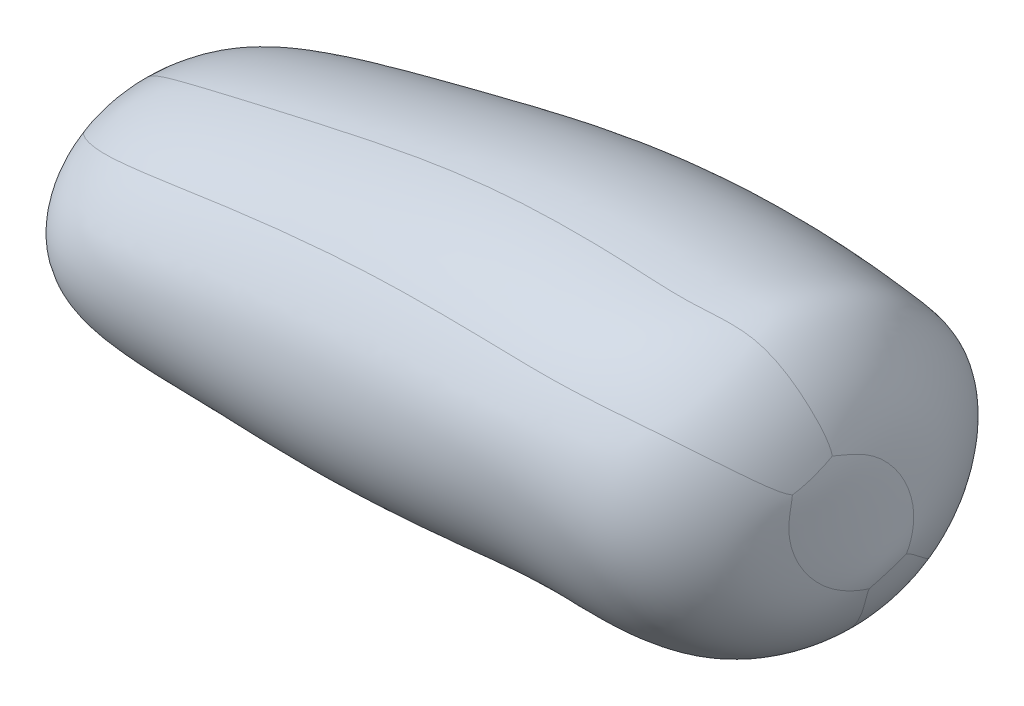
ISO-10303-21;
HEADER;
FILE_DESCRIPTION(('STEP AP214'),'2;1');
FILE_NAME('part.step','',(''),(''),'','','');
FILE_SCHEMA(('AUTOMOTIVE_DESIGN { 1 0 10303 214 1 1 1 1 }'));
ENDSEC;
DATA;
#1=APPLICATION_CONTEXT('core data for automotive mechanical design processes');
#2=APPLICATION_PROTOCOL_DEFINITION('international standard','automotive_design',2000,#1);
#3=PRODUCT_CONTEXT('',#1,'mechanical');
#4=PRODUCT('Part','Part','',(#3));
#5=PRODUCT_RELATED_PRODUCT_CATEGORY('part','',(#4));
#6=PRODUCT_DEFINITION_FORMATION('','',#4);
#7=PRODUCT_DEFINITION_CONTEXT('part definition',#1,'design');
#8=PRODUCT_DEFINITION('design','',#6,#7);
#9=PRODUCT_DEFINITION_SHAPE('','',#8);
#10=(LENGTH_UNIT() NAMED_UNIT(*) SI_UNIT(.MILLI.,.METRE.));
#11=(NAMED_UNIT(*) PLANE_ANGLE_UNIT() SI_UNIT($,.RADIAN.));
#12=(NAMED_UNIT(*) SI_UNIT($,.STERADIAN.) SOLID_ANGLE_UNIT());
#13=UNCERTAINTY_MEASURE_WITH_UNIT(LENGTH_MEASURE(1.E-05),#10,'distance_accuracy_value','');
#14=(GEOMETRIC_REPRESENTATION_CONTEXT(3) GLOBAL_UNCERTAINTY_ASSIGNED_CONTEXT((#13)) GLOBAL_UNIT_ASSIGNED_CONTEXT((#10,
#11,#12)) REPRESENTATION_CONTEXT('',''));
#15=CARTESIAN_POINT('',(0.,0.,0.));
#16=DIRECTION('',(0.,0.,1.));
#17=DIRECTION('',(1.,0.,0.));
#18=AXIS2_PLACEMENT_3D('',#15,#16,#17);
#19=CARTESIAN_POINT('',(-727.895789819224,1292.65890692874,-70.9432487680695));
#20=CARTESIAN_POINT('',(-727.857524019156,1292.38177219003,-70.8732314316989));
#21=CARTESIAN_POINT('',(-727.905739717747,1291.5047341162,-70.6595793708024));
#22=CARTESIAN_POINT('',(-727.834002271788,1289.98047705633,-71.1788160614715));
#23=CARTESIAN_POINT('',(-727.667985820476,1288.81372941667,-72.3345478832622));
#24=CARTESIAN_POINT('',(-727.547713675373,1288.54567045909,-73.2427129927334));
#25=CARTESIAN_POINT('',(-727.564856032333,1288.44414561946,-73.5326746284668));
#26=CARTESIAN_POINT('',(-727.796348808504,1292.8187628822,-71.2954137454042));
#27=CARTESIAN_POINT('',(-727.620376197703,1292.4243493582,-71.5075440499976));
#28=CARTESIAN_POINT('',(-727.626561269885,1291.78696202304,-71.6066960040137));
#29=CARTESIAN_POINT('',(-727.555004615375,1290.48259809938,-72.2163442303886));
#30=CARTESIAN_POINT('',(-727.434232896889,1289.36591742474,-73.0510224292963));
#31=CARTESIAN_POINT('',(-727.359702592075,1289.00604089982,-73.5740155390169));
#32=CARTESIAN_POINT('',(-727.479421669154,1288.62356842,-73.8433067194807));
#33=CARTESIAN_POINT('',(-727.712017393636,1293.16065270003,-71.9460933700439));
#34=CARTESIAN_POINT('',(-727.528940626787,1292.79249201574,-72.2277667098039));
#35=CARTESIAN_POINT('',(-727.473333151987,1292.39699798181,-72.8451207947792));
#36=CARTESIAN_POINT('',(-727.388988275449,1291.16504227292,-73.7287743224565));
#37=CARTESIAN_POINT('',(-727.313409549502,1289.89254181415,-74.2378973102862));
#38=CARTESIAN_POINT('',(-727.291868138648,1289.31106783875,-74.2633470211125));
#39=CARTESIAN_POINT('',(-727.41871593257,1288.89804019793,-74.4652319099678));
#40=CARTESIAN_POINT('',(-727.722383747756,1293.35609011737,-72.2879019208983));
#41=CARTESIAN_POINT('',(-727.636028541387,1293.26972848392,-72.5996428661946));
#42=CARTESIAN_POINT('',(-727.533474358314,1292.97449605668,-73.6342823115046));
#43=CARTESIAN_POINT('',(-727.4304347669,1291.61243879408,-74.8125613279919));
#44=CARTESIAN_POINT('',(-727.372398511132,1290.07072257254,-75.1784526051494));
#45=CARTESIAN_POINT('',(-727.381827550363,1289.27332753256,-74.8920533931292));
#46=CARTESIAN_POINT('',(-727.436406275746,1289.01055587408,-74.8170745283677));
#47=(BOUNDED_SURFACE() B_SPLINE_SURFACE(3,3,((#19,#20,#21,#22,#23,#24,#25),(#26,#27,#28,#29,#30,
#31,#32),(#33,#34,#35,#36,#37,#38,#39),(#40,#41,#42,#43,#44,#45,#46)),.UNSPECIFIED.,.F.,.F.,
.F.) B_SPLINE_SURFACE_WITH_KNOTS((4,4),(4,1,1,1,4),(0.,1.),(0.,1.,2.,3.,4.),
.UNSPECIFIED.) GEOMETRIC_REPRESENTATION_ITEM() RATIONAL_B_SPLINE_SURFACE(((0.75,1.,1.,1.,1.,1.,
0.75),(1.,1.,1.,1.,1.,1.,1.),(1.,1.,1.,1.,1.,1.,1.),(0.75,1.,1.,1.,1.,1.,0.75))) REPRESENTATION_ITEM('') SURFACE());
#48=CARTESIAN_POINT('',(-727.722383747756,1293.35609011737,-72.2879019208983));
#49=CARTESIAN_POINT('',(-727.712017393636,1293.16065270003,-71.9460933700439));
#50=CARTESIAN_POINT('',(-727.796348808504,1292.8187628822,-71.2954137454042));
#51=CARTESIAN_POINT('',(-727.895789819224,1292.65890692874,-70.9432487680695));
#52=(BOUNDED_CURVE() B_SPLINE_CURVE(3,(#48,#49,#50,#51),.UNSPECIFIED.,.F.,
.F.) B_SPLINE_CURVE_WITH_KNOTS((4,4),(0.,1.),
.UNSPECIFIED.) CURVE() GEOMETRIC_REPRESENTATION_ITEM() RATIONAL_B_SPLINE_CURVE((0.75,1.,1.,0.75)) REPRESENTATION_ITEM(''));
#53=CARTESIAN_POINT('',(-727.722383747755,1293.35609011737,-72.2879019208983));
#54=VERTEX_POINT('',#53);
#55=CARTESIAN_POINT('',(-727.895789819224,1292.65890692874,-70.9432487680695));
#56=VERTEX_POINT('',#55);
#57=EDGE_CURVE('E76',#54,#56,#52,.T.);
#58=CARTESIAN_POINT('',(-727.564856032333,1288.44414561946,-73.5326746284668));
#59=CARTESIAN_POINT('',(-727.547713675373,1288.54567045909,-73.2427129927334));
#60=CARTESIAN_POINT('',(-727.667985820476,1288.81372941667,-72.3345478832622));
#61=CARTESIAN_POINT('',(-727.834002271788,1289.98047705633,-71.1788160614715));
#62=CARTESIAN_POINT('',(-727.905739717747,1291.5047341162,-70.6595793708024));
#63=CARTESIAN_POINT('',(-727.857524019156,1292.38177219003,-70.8732314316989));
#64=CARTESIAN_POINT('',(-727.895789819224,1292.65890692874,-70.9432487680695));
#65=(BOUNDED_CURVE() B_SPLINE_CURVE(3,(#58,#59,#60,#61,#62,#63,#64),.UNSPECIFIED.,.F.,
.F.) B_SPLINE_CURVE_WITH_KNOTS((4,1,1,1,4),(0.,1.,2.,3.,4.),
.UNSPECIFIED.) CURVE() GEOMETRIC_REPRESENTATION_ITEM() RATIONAL_B_SPLINE_CURVE((0.75,1.,1.,1.,
1.,1.,0.75)) REPRESENTATION_ITEM(''));
#66=CARTESIAN_POINT('',(-727.564856032333,1288.44414561946,-73.5326746284668));
#67=VERTEX_POINT('',#66);
#68=EDGE_CURVE('E85',#56,#67,#65,.F.);
#69=CARTESIAN_POINT('',(-727.564856032333,1288.44414561946,-73.5326746284668));
#70=CARTESIAN_POINT('',(-727.479421669154,1288.62356842,-73.8433067194807));
#71=CARTESIAN_POINT('',(-727.41871593257,1288.89804019793,-74.4652319099678));
#72=CARTESIAN_POINT('',(-727.436406275746,1289.01055587408,-74.8170745283677));
#73=(BOUNDED_CURVE() B_SPLINE_CURVE(3,(#69,#70,#71,#72),.UNSPECIFIED.,.F.,
.F.) B_SPLINE_CURVE_WITH_KNOTS((4,4),(0.,1.),
.UNSPECIFIED.) CURVE() GEOMETRIC_REPRESENTATION_ITEM() RATIONAL_B_SPLINE_CURVE((0.75,1.,1.,0.75)) REPRESENTATION_ITEM(''));
#74=CARTESIAN_POINT('',(-727.436406275746,1289.01055587408,-74.8170745283677));
#75=VERTEX_POINT('',#74);
#76=EDGE_CURVE('E96',#75,#67,#73,.F.);
#77=CARTESIAN_POINT('',(-727.722383747756,1293.35609011737,-72.2879019208983));
#78=CARTESIAN_POINT('',(-727.636028541387,1293.26972848392,-72.5996428661946));
#79=CARTESIAN_POINT('',(-727.533474358314,1292.97449605668,-73.6342823115046));
#80=CARTESIAN_POINT('',(-727.4304347669,1291.61243879408,-74.8125613279919));
#81=CARTESIAN_POINT('',(-727.372398511132,1290.07072257254,-75.1784526051494));
#82=CARTESIAN_POINT('',(-727.381827550363,1289.27332753256,-74.8920533931292));
#83=CARTESIAN_POINT('',(-727.436406275746,1289.01055587408,-74.8170745283677));
#84=(BOUNDED_CURVE() B_SPLINE_CURVE(3,(#77,#78,#79,#80,#81,#82,#83),.UNSPECIFIED.,.F.,
.F.) B_SPLINE_CURVE_WITH_KNOTS((4,1,1,1,4),(0.,1.,2.,3.,4.),
.UNSPECIFIED.) CURVE() GEOMETRIC_REPRESENTATION_ITEM() RATIONAL_B_SPLINE_CURVE((0.75,1.,1.,1.,
1.,1.,0.75)) REPRESENTATION_ITEM(''));
#85=EDGE_CURVE('E91',#75,#54,#84,.F.);
#86=ORIENTED_EDGE('',*,*,#57,.T.);
#87=ORIENTED_EDGE('',*,*,#68,.T.);
#88=ORIENTED_EDGE('',*,*,#76,.F.);
#89=ORIENTED_EDGE('',*,*,#85,.T.);
#90=EDGE_LOOP('',(#86,#87,#88,#89));
#91=FACE_BOUND('',#90,.T.);
#92=ADVANCED_FACE('F33',(#91),#47,.F.);
#93=CARTESIAN_POINT('',(-755.014879818642,1287.97849475578,-75.1172633321439));
#94=CARTESIAN_POINT('',(-755.057385758139,1287.9570606178,-74.9120658524479));
#95=CARTESIAN_POINT('',(-755.063471767567,1287.85819814991,-74.6337821203936));
#96=CARTESIAN_POINT('',(-755.033113350125,1287.75887682449,-74.4767551033329));
#97=CARTESIAN_POINT('',(-755.06122132346,1288.13126399053,-75.1078987517353));
#98=CARTESIAN_POINT('',(-755.192574707307,1288.24116494933,-74.6881392119674));
#99=CARTESIAN_POINT('',(-755.200898040066,1288.14349163443,-74.4087359657216));
#100=CARTESIAN_POINT('',(-755.086647277643,1287.85186290404,-74.2857185174883));
#101=CARTESIAN_POINT('',(-755.086103670054,1288.50059527492,-75.1851484772914));
#102=CARTESIAN_POINT('',(-755.21929976703,1288.48311726901,-74.6136355015905));
#103=CARTESIAN_POINT('',(-755.240101461572,1288.31732025296,-74.1161780775991));
#104=CARTESIAN_POINT('',(-755.148751322479,1288.02615834245,-73.720476585463));
#105=CARTESIAN_POINT('',(-755.1267382632,1289.18509086621,-74.931151549474));
#106=CARTESIAN_POINT('',(-755.264763329354,1289.00145915323,-74.3349160066463));
#107=CARTESIAN_POINT('',(-755.309451855107,1288.82398961778,-73.6967182402692));
#108=CARTESIAN_POINT('',(-755.258968056771,1288.67692141898,-73.0509247602259));
#109=CARTESIAN_POINT('',(-755.165272370879,1289.78651593524,-74.2983461284783));
#110=CARTESIAN_POINT('',(-755.290350904579,1289.46844146881,-73.9564043565626));
#111=CARTESIAN_POINT('',(-755.329385453577,1289.30330240133,-73.4827999750355));
#112=CARTESIAN_POINT('',(-755.279550093349,1289.30986989604,-72.9033813629524));
#113=CARTESIAN_POINT('',(-755.195576944326,1289.90756972413,-73.8102711033398));
#114=CARTESIAN_POINT('',(-755.306267727319,1289.59846367453,-73.718454654009));
#115=CARTESIAN_POINT('',(-755.333914853405,1289.49482605693,-73.4573715699588));
#116=CARTESIAN_POINT('',(-755.276736285075,1289.60862021366,-73.0416384346972));
#117=CARTESIAN_POINT('',(-755.178045057932,1289.99069534717,-73.6338308834892));
#118=CARTESIAN_POINT('',(-755.224624506221,1289.87770513389,-73.499702548893));
#119=CARTESIAN_POINT('',(-755.256322550127,1289.76800039184,-73.2431425393574));
#120=CARTESIAN_POINT('',(-755.244067605669,1289.75280505135,-73.0373967927204));
#121=(BOUNDED_SURFACE() B_SPLINE_SURFACE(3,3,((#93,#94,#95,#96),(#97,#98,#99,#100),(#101,#102,
#103,#104),(#105,#106,#107,#108),(#109,#110,#111,#112),(#113,#114,#115,#116),(#117,#118,#119,
#120)),.UNSPECIFIED.,.F.,.F.,.F.) B_SPLINE_SURFACE_WITH_KNOTS((4,1,1,1,4),(4,4),(0.,1.,2.,3.,
4.),(0.,1.),.UNSPECIFIED.) GEOMETRIC_REPRESENTATION_ITEM() RATIONAL_B_SPLINE_SURFACE(((0.75,1.,
1.,0.75),(1.,1.,1.,1.),(1.,1.,1.,1.),(1.,1.,1.,1.),(1.,1.,1.,1.),(1.,1.,1.,1.),(0.75,1.,1.,0.75))) REPRESENTATION_ITEM('') SURFACE());
#122=CARTESIAN_POINT('',(-755.178045057932,1289.99069534717,-73.6338308834892));
#123=CARTESIAN_POINT('',(-755.195576944326,1289.90756972413,-73.8102711033398));
#124=CARTESIAN_POINT('',(-755.165272370879,1289.78651593524,-74.2983461284783));
#125=CARTESIAN_POINT('',(-755.1267382632,1289.18509086621,-74.931151549474));
#126=CARTESIAN_POINT('',(-755.086103670054,1288.50059527492,-75.1851484772914));
#127=CARTESIAN_POINT('',(-755.06122132346,1288.13126399053,-75.1078987517353));
#128=CARTESIAN_POINT('',(-755.014879818642,1287.97849475578,-75.1172633321439));
#129=(BOUNDED_CURVE() B_SPLINE_CURVE(3,(#122,#123,#124,#125,#126,#127,#128),.UNSPECIFIED.,.F.,
.F.) B_SPLINE_CURVE_WITH_KNOTS((4,1,1,1,4),(0.,1.,2.,3.,4.),
.UNSPECIFIED.) CURVE() GEOMETRIC_REPRESENTATION_ITEM() RATIONAL_B_SPLINE_CURVE((0.75,1.,1.,1.,
1.,1.,0.75)) REPRESENTATION_ITEM(''));
#130=CARTESIAN_POINT('',(-755.178045057932,1289.99069534717,-73.6338308834892));
#131=VERTEX_POINT('',#130);
#132=CARTESIAN_POINT('',(-755.014879818642,1287.97849475578,-75.1172633321439));
#133=VERTEX_POINT('',#132);
#134=EDGE_CURVE('E93',#131,#133,#129,.T.);
#135=CARTESIAN_POINT('',(-755.014879818642,1287.97849475578,-75.1172633321439));
#136=CARTESIAN_POINT('',(-755.057385758139,1287.9570606178,-74.9120658524479));
#137=CARTESIAN_POINT('',(-755.063471767567,1287.85819814991,-74.6337821203936));
#138=CARTESIAN_POINT('',(-755.033113350125,1287.75887682449,-74.4767551033329));
#139=(BOUNDED_CURVE() B_SPLINE_CURVE(3,(#135,#136,#137,#138),.UNSPECIFIED.,.F.,
.F.) B_SPLINE_CURVE_WITH_KNOTS((4,4),(0.,1.),
.UNSPECIFIED.) CURVE() GEOMETRIC_REPRESENTATION_ITEM() RATIONAL_B_SPLINE_CURVE((0.75,1.,1.,0.75)) REPRESENTATION_ITEM(''));
#140=CARTESIAN_POINT('',(-755.033113350125,1287.75887682449,-74.4767551033383));
#141=VERTEX_POINT('',#140);
#142=EDGE_CURVE('E52',#141,#133,#139,.F.);
#143=CARTESIAN_POINT('',(-755.033113350125,1287.75887682449,-74.4767551033438));
#144=CARTESIAN_POINT('',(-755.086647277643,1287.85186290404,-74.2857185174883));
#145=CARTESIAN_POINT('',(-755.148751322479,1288.02615834245,-73.720476585463));
#146=CARTESIAN_POINT('',(-755.258968056771,1288.67692141898,-73.0509247602259));
#147=CARTESIAN_POINT('',(-755.279550093349,1289.30986989604,-72.9033813629524));
#148=CARTESIAN_POINT('',(-755.276736285075,1289.60862021366,-73.0416384346972));
#149=CARTESIAN_POINT('',(-755.244067605669,1289.75280505135,-73.0373967927204));
#150=(BOUNDED_CURVE() B_SPLINE_CURVE(3,(#143,#144,#145,#146,#147,#148,#149),.UNSPECIFIED.,.F.,
.F.) B_SPLINE_CURVE_WITH_KNOTS((4,1,1,1,4),(0.,1.,2.,3.,4.),
.UNSPECIFIED.) CURVE() GEOMETRIC_REPRESENTATION_ITEM() RATIONAL_B_SPLINE_CURVE((0.75,1.,1.,1.,
1.,1.,0.75)) REPRESENTATION_ITEM(''));
#151=CARTESIAN_POINT('',(-755.244067605669,1289.75280505135,-73.0373967927204));
#152=VERTEX_POINT('',#151);
#153=EDGE_CURVE('E97',#141,#152,#150,.T.);
#154=CARTESIAN_POINT('',(-755.178045057932,1289.99069534717,-73.6338308834892));
#155=CARTESIAN_POINT('',(-755.224624506221,1289.87770513389,-73.499702548893));
#156=CARTESIAN_POINT('',(-755.256322550127,1289.76800039184,-73.2431425393574));
#157=CARTESIAN_POINT('',(-755.244067605669,1289.75280505135,-73.0373967927204));
#158=(BOUNDED_CURVE() B_SPLINE_CURVE(3,(#154,#155,#156,#157),.UNSPECIFIED.,.F.,
.F.) B_SPLINE_CURVE_WITH_KNOTS((4,4),(0.,1.),
.UNSPECIFIED.) CURVE() GEOMETRIC_REPRESENTATION_ITEM() RATIONAL_B_SPLINE_CURVE((0.75,1.,1.,0.75)) REPRESENTATION_ITEM(''));
#159=EDGE_CURVE('E86',#152,#131,#158,.F.);
#160=ORIENTED_EDGE('',*,*,#134,.T.);
#161=ORIENTED_EDGE('',*,*,#142,.F.);
#162=ORIENTED_EDGE('',*,*,#153,.T.);
#163=ORIENTED_EDGE('',*,*,#159,.T.);
#164=EDGE_LOOP('',(#160,#161,#162,#163));
#165=FACE_BOUND('',#164,.T.);
#166=ADVANCED_FACE('F163',(#165),#121,.F.);
#167=CARTESIAN_POINT('',(-727.722383747756,1293.35609011737,-72.2879019208983));
#168=CARTESIAN_POINT('',(-727.819105308235,1293.63788916819,-72.3179695264456));
#169=CARTESIAN_POINT('',(-728.290605123611,1294.79025051674,-72.083875004874));
#170=CARTESIAN_POINT('',(-729.993297337214,1296.54080175125,-71.738393275777));
#171=CARTESIAN_POINT('',(-732.026306080385,1296.78297347157,-71.1234481707237));
#172=CARTESIAN_POINT('',(-734.695116307576,1296.84893042592,-71.2897813243634));
#173=CARTESIAN_POINT('',(-738.934248234094,1296.60223251188,-71.5395829376779));
#174=CARTESIAN_POINT('',(-743.012796555307,1295.85668343347,-71.7878166282849));
#175=CARTESIAN_POINT('',(-747.211773800277,1294.83782443925,-71.9242055144165));
#176=CARTESIAN_POINT('',(-752.170140541484,1293.74357684058,-71.8492873666994));
#177=CARTESIAN_POINT('',(-754.285607337962,1292.58514020564,-72.595537831461));
#178=CARTESIAN_POINT('',(-754.88695836432,1291.17900652082,-73.2033959914851));
#179=CARTESIAN_POINT('',(-755.113933723229,1290.1868111835,-73.5915189982347));
#180=CARTESIAN_POINT('',(-755.178045057932,1289.99069534717,-73.6338308834892));
#181=CARTESIAN_POINT('',(-727.712017393636,1293.16065270003,-71.9460933700439));
#182=CARTESIAN_POINT('',(-727.895094160484,1293.52881338429,-71.664420030295));
#183=CARTESIAN_POINT('',(-728.399332372036,1294.63341880558,-71.1521262187215));
#184=CARTESIAN_POINT('',(-730.169314049619,1296.31891815501,-70.3640544804756));
#185=CARTESIAN_POINT('',(-732.488999770488,1296.60575672968,-69.6478937481823));
#186=CARTESIAN_POINT('',(-735.131728196297,1296.63231619132,-69.7968400254159));
#187=CARTESIAN_POINT('',(-739.298675965856,1296.36205353638,-70.0928835276479));
#188=CARTESIAN_POINT('',(-743.29462803096,1295.63547314435,-70.4195967988877));
#189=CARTESIAN_POINT('',(-747.435960091803,1294.67110787638,-70.6394314698303));
#190=CARTESIAN_POINT('',(-752.277612800238,1293.64746611925,-70.634291817322));
#191=CARTESIAN_POINT('',(-754.369492393668,1292.50544926655,-71.692235789989));
#192=CARTESIAN_POINT('',(-754.938495512562,1291.12803926481,-72.6517482634934));
#193=CARTESIAN_POINT('',(-755.142981285133,1290.15694659326,-73.2809504437879));
#194=CARTESIAN_POINT('',(-755.224624506221,1289.87770513389,-73.499702548893));
#195=CARTESIAN_POINT('',(-727.796348808504,1292.8187628822,-71.2954137454042));
#196=CARTESIAN_POINT('',(-727.972321419313,1293.21317640619,-71.0832834408107));
#197=CARTESIAN_POINT('',(-728.50993555364,1294.18089988517,-70.3309596389112));
#198=CARTESIAN_POINT('',(-730.351561443995,1295.66319238026,-69.1816445031491));
#199=CARTESIAN_POINT('',(-732.983935030914,1295.96517847392,-68.5221260408923));
#200=CARTESIAN_POINT('',(-735.660474423057,1295.96898621265,-68.6559685193281));
#201=CARTESIAN_POINT('',(-739.748444483117,1295.67429254446,-68.9895685472593));
#202=CARTESIAN_POINT('',(-743.659189532914,1294.99645252456,-69.3650719752277));
#203=CARTESIAN_POINT('',(-747.711729359048,1294.14176535882,-69.6279466906084));
#204=CARTESIAN_POINT('',(-752.410514217872,1293.23012135033,-69.6642064085657));
#205=CARTESIAN_POINT('',(-754.472544177692,1292.18246683527,-70.9636204455999));
#206=CARTESIAN_POINT('',(-755.00183556846,1290.92649745054,-72.205282329054));
#207=CARTESIAN_POINT('',(-755.17873024685,1290.04117472674,-73.0289135087669));
#208=CARTESIAN_POINT('',(-755.256322550127,1289.76800039184,-73.2431425393574));
#209=CARTESIAN_POINT('',(-727.895789819224,1292.65890692874,-70.9432487680695));
#210=CARTESIAN_POINT('',(-728.033496629966,1292.77618571402,-70.6611011271164));
#211=CARTESIAN_POINT('',(-728.598933078607,1293.55676413379,-69.7350593806043));
#212=CARTESIAN_POINT('',(-730.507804028053,1294.75455141773,-68.3255963797719));
#213=CARTESIAN_POINT('',(-733.443945940114,1295.05625137399,-67.735861521208));
#214=CARTESIAN_POINT('',(-736.136471599127,1295.03805695614,-67.8408564326926));
#215=CARTESIAN_POINT('',(-740.153747354755,1294.75338806826,-68.169908449784));
#216=CARTESIAN_POINT('',(-743.974821303926,1294.15708293196,-68.5605004206713));
#217=CARTESIAN_POINT('',(-747.942510080907,1293.42832072398,-68.8413158814309));
#218=CARTESIAN_POINT('',(-752.482503787595,1292.65081362084,-68.8945629434962));
#219=CARTESIAN_POINT('',(-754.530297263763,1291.73399517379,-70.3837362076025));
#220=CARTESIAN_POINT('',(-755.037694347139,1290.6477563614,-71.8491388965904));
#221=CARTESIAN_POINT('',(-755.199143981806,1289.88179454855,-72.8274094041066));
#222=CARTESIAN_POINT('',(-755.244067605669,1289.75280505135,-73.0373967927204));
#223=(BOUNDED_SURFACE() B_SPLINE_SURFACE(3,3,((#167,#168,#169,#170,#171,#172,#173,#174,#175,
#176,#177,#178,#179,#180),(#181,#182,#183,#184,#185,#186,#187,#188,#189,#190,#191,#192,#193,
#194),(#195,#196,#197,#198,#199,#200,#201,#202,#203,#204,#205,#206,#207,#208),(#209,#210,#211,
#212,#213,#214,#215,#216,#217,#218,#219,#220,#221,#222)),.UNSPECIFIED.,.F.,.F.,
.F.) B_SPLINE_SURFACE_WITH_KNOTS((4,4),(4,1,1,1,1,1,1,1,1,1,1,4),(0.,1.),(0.,1.,2.,3.,4.,5.,6.,
7.,8.,9.,10.,11.),
.UNSPECIFIED.) GEOMETRIC_REPRESENTATION_ITEM() RATIONAL_B_SPLINE_SURFACE(((0.75,1.,1.,1.,1.,1.,
1.,1.,1.,1.,1.,1.,1.,0.75),(1.,1.,1.,1.,1.,1.,1.,1.,1.,1.,1.,1.,1.,1.),(1.,1.,1.,1.,1.,1.,1.,1.,
1.,1.,1.,1.,1.,1.),(0.75,1.,1.,1.,1.,1.,1.,1.,1.,1.,1.,1.,1.,0.75))) REPRESENTATION_ITEM('') SURFACE());
#224=CARTESIAN_POINT('',(-727.722383747756,1293.35609011737,-72.2879019208983));
#225=CARTESIAN_POINT('',(-727.819105308235,1293.63788916819,-72.3179695264456));
#226=CARTESIAN_POINT('',(-728.290605123611,1294.79025051674,-72.083875004874));
#227=CARTESIAN_POINT('',(-729.993297337214,1296.54080175125,-71.738393275777));
#228=CARTESIAN_POINT('',(-732.026306080385,1296.78297347157,-71.1234481707237));
#229=CARTESIAN_POINT('',(-734.695116307576,1296.84893042592,-71.2897813243634));
#230=CARTESIAN_POINT('',(-738.934248234094,1296.60223251188,-71.5395829376779));
#231=CARTESIAN_POINT('',(-743.012796555307,1295.85668343347,-71.7878166282849));
#232=CARTESIAN_POINT('',(-747.211773800277,1294.83782443925,-71.9242055144165));
#233=CARTESIAN_POINT('',(-752.170140541484,1293.74357684058,-71.8492873666994));
#234=CARTESIAN_POINT('',(-754.285607337962,1292.58514020564,-72.595537831461));
#235=CARTESIAN_POINT('',(-754.88695836432,1291.17900652082,-73.2033959914851));
#236=CARTESIAN_POINT('',(-755.113933723229,1290.1868111835,-73.5915189982347));
#237=CARTESIAN_POINT('',(-755.178045057932,1289.99069534717,-73.6338308834892));
#238=(BOUNDED_CURVE() B_SPLINE_CURVE(3,(#224,#225,#226,#227,#228,#229,#230,#231,#232,#233,#234,
#235,#236,#237),.UNSPECIFIED.,.F.,.F.) B_SPLINE_CURVE_WITH_KNOTS((4,1,1,1,1,1,1,1,1,1,1,4),(0.,
1.,2.,3.,4.,5.,6.,7.,8.,9.,10.,11.),
.UNSPECIFIED.) CURVE() GEOMETRIC_REPRESENTATION_ITEM() RATIONAL_B_SPLINE_CURVE((0.75,1.,1.,1.,
1.,1.,1.,1.,1.,1.,1.,1.,1.,0.75)) REPRESENTATION_ITEM(''));
#239=EDGE_CURVE('E79',#54,#131,#238,.T.);
#240=CARTESIAN_POINT('',(-727.895789819224,1292.65890692874,-70.9432487680695));
#241=CARTESIAN_POINT('',(-728.033496629966,1292.77618571402,-70.6611011271164));
#242=CARTESIAN_POINT('',(-728.598933078607,1293.55676413379,-69.7350593806043));
#243=CARTESIAN_POINT('',(-730.507804028053,1294.75455141773,-68.3255963797719));
#244=CARTESIAN_POINT('',(-733.443945940114,1295.05625137399,-67.735861521208));
#245=CARTESIAN_POINT('',(-736.136471599127,1295.03805695614,-67.8408564326926));
#246=CARTESIAN_POINT('',(-740.153747354755,1294.75338806826,-68.169908449784));
#247=CARTESIAN_POINT('',(-743.974821303926,1294.15708293196,-68.5605004206713));
#248=CARTESIAN_POINT('',(-747.942510080907,1293.42832072398,-68.8413158814309));
#249=CARTESIAN_POINT('',(-752.482503787595,1292.65081362084,-68.8945629434962));
#250=CARTESIAN_POINT('',(-754.530297263763,1291.73399517379,-70.3837362076025));
#251=CARTESIAN_POINT('',(-755.037694347139,1290.6477563614,-71.8491388965904));
#252=CARTESIAN_POINT('',(-755.199143981806,1289.88179454855,-72.8274094041066));
#253=CARTESIAN_POINT('',(-755.244067605669,1289.75280505135,-73.0373967927204));
#254=(BOUNDED_CURVE() B_SPLINE_CURVE(3,(#240,#241,#242,#243,#244,#245,#246,#247,#248,#249,#250,
#251,#252,#253),.UNSPECIFIED.,.F.,.F.) B_SPLINE_CURVE_WITH_KNOTS((4,1,1,1,1,1,1,1,1,1,1,4),(0.,
1.,2.,3.,4.,5.,6.,7.,8.,9.,10.,11.),
.UNSPECIFIED.) CURVE() GEOMETRIC_REPRESENTATION_ITEM() RATIONAL_B_SPLINE_CURVE((0.75,1.,1.,1.,
1.,1.,1.,1.,1.,1.,1.,1.,1.,0.75)) REPRESENTATION_ITEM(''));
#255=EDGE_CURVE('E81',#152,#56,#254,.F.);
#256=ORIENTED_EDGE('',*,*,#57,.F.);
#257=ORIENTED_EDGE('',*,*,#239,.T.);
#258=ORIENTED_EDGE('',*,*,#159,.F.);
#259=ORIENTED_EDGE('',*,*,#255,.T.);
#260=EDGE_LOOP('',(#256,#257,#258,#259));
#261=FACE_BOUND('',#260,.T.);
#262=ADVANCED_FACE('F78',(#261),#223,.F.);
#263=CARTESIAN_POINT('',(-727.564856032333,1288.44414561946,-73.5326746284668));
#264=CARTESIAN_POINT('',(-727.547713675373,1288.54567045909,-73.2427129927334));
#265=CARTESIAN_POINT('',(-727.667985820476,1288.81372941667,-72.3345478832622));
#266=CARTESIAN_POINT('',(-727.834002271788,1289.98047705633,-71.1788160614715));
#267=CARTESIAN_POINT('',(-727.905739717747,1291.5047341162,-70.6595793708024));
#268=CARTESIAN_POINT('',(-727.857524019156,1292.38177219003,-70.8732314316989));
#269=CARTESIAN_POINT('',(-727.895789819224,1292.65890692874,-70.9432487680695));
#270=CARTESIAN_POINT('',(-727.667432752443,1288.16319797926,-73.5120041731973));
#271=CARTESIAN_POINT('',(-727.735724758671,1288.08530001835,-72.9114104464498));
#272=CARTESIAN_POINT('',(-727.901738744064,1288.2615414086,-71.6180733372281));
#273=CARTESIAN_POINT('',(-728.112999928212,1289.47835601329,-70.1412878925652));
#274=CARTESIAN_POINT('',(-728.184918165599,1291.22250620935,-69.7124627375911));
#275=CARTESIAN_POINT('',(-728.094671840629,1292.33919502186,-70.2389188134111));
#276=CARTESIAN_POINT('',(-728.033496629966,1292.77618571402,-70.6611011271164));
#277=CARTESIAN_POINT('',(-728.07986239113,1286.98993405768,-73.8128618312458));
#278=CARTESIAN_POINT('',(-728.179638803962,1286.8813288514,-72.961908687954));
#279=CARTESIAN_POINT('',(-728.422642362584,1287.13349487329,-71.1229703774857));
#280=CARTESIAN_POINT('',(-728.724496492989,1288.86221690636,-69.013080863534));
#281=CARTESIAN_POINT('',(-728.822714340166,1291.34112321768,-68.3978912487022));
#282=CARTESIAN_POINT('',(-728.687930603554,1292.93262838239,-69.1391591222976));
#283=CARTESIAN_POINT('',(-728.598933078607,1293.55676413379,-69.7350593806043));
#284=CARTESIAN_POINT('',(-729.781204378306,1285.09954721615,-74.5303486823939));
#285=CARTESIAN_POINT('',(-729.949512906394,1284.96369863276,-73.285927841842));
#286=CARTESIAN_POINT('',(-730.351115628061,1285.36677366015,-70.5625717483312));
#287=CARTESIAN_POINT('',(-730.812730007478,1287.90923285848,-67.381224067216));
#288=CARTESIAN_POINT('',(-730.924522159637,1291.52279815456,-66.410175717593));
#289=CARTESIAN_POINT('',(-730.664046612121,1293.84591045519,-67.4695482564055));
#290=CARTESIAN_POINT('',(-730.507804028053,1294.75455141773,-68.3255963797719));
#291=CARTESIAN_POINT('',(-732.958813975054,1284.69758490459,-75.7079598859067));
#292=CARTESIAN_POINT('',(-733.318059959277,1284.65868533768,-74.3737394264784));
#293=CARTESIAN_POINT('',(-734.127068850907,1285.27042921415,-71.2602144693379));
#294=CARTESIAN_POINT('',(-734.887389760303,1288.09437935846,-67.4130830204332));
#295=CARTESIAN_POINT('',(-734.754129965262,1291.79277238589,-66.0560743373227));
#296=CARTESIAN_POINT('',(-733.903956849314,1294.14732427406,-66.9495970015019));
#297=CARTESIAN_POINT('',(-733.443945940114,1295.05625137399,-67.735861521208));
#298=CARTESIAN_POINT('',(-735.311236314139,1284.64996652802,-75.8877578827993));
#299=CARTESIAN_POINT('',(-735.665274740328,1284.55699438176,-74.5167069962838));
#300=CARTESIAN_POINT('',(-736.527391475341,1285.06568385157,-71.267892464171));
#301=CARTESIAN_POINT('',(-737.443913956269,1287.94360427453,-67.2365689253537));
#302=CARTESIAN_POINT('',(-737.458965025845,1291.71007063091,-66.0470390116692));
#303=CARTESIAN_POINT('',(-736.612468775169,1294.10712769962,-67.0257443460572));
#304=CARTESIAN_POINT('',(-736.136471599127,1295.03805695614,-67.8408564326926));
#305=CARTESIAN_POINT('',(-739.146127607239,1284.26017388913,-76.0765170849293));
#306=CARTESIAN_POINT('',(-739.445403425911,1284.12603471978,-74.6323843758974));
#307=CARTESIAN_POINT('',(-740.294047746306,1284.62445628555,-71.1624114271849));
#308=CARTESIAN_POINT('',(-741.195140521387,1287.76558583526,-67.0801986924583));
#309=CARTESIAN_POINT('',(-741.280724678406,1291.5243876712,-66.2782379232393));
#310=CARTESIAN_POINT('',(-740.559050226394,1293.83248359208,-67.3502483523414));
#311=CARTESIAN_POINT('',(-740.153747354755,1294.75338806826,-68.169908449784));
#312=CARTESIAN_POINT('',(-743.117110155866,1283.94647614012,-76.1104140947528));
#313=CARTESIAN_POINT('',(-743.368900194143,1283.81015212293,-74.6554711061052));
#314=CARTESIAN_POINT('',(-744.121817267956,1284.34837809344,-71.1174481121914));
#315=CARTESIAN_POINT('',(-744.866927870859,1287.67194665943,-67.1971456265503));
#316=CARTESIAN_POINT('',(-744.823857155067,1291.23827620857,-66.6466922952855));
#317=CARTESIAN_POINT('',(-744.290453074937,1293.31771333936,-67.7559288661258));
#318=CARTESIAN_POINT('',(-743.974821303926,1294.15708293196,-68.5605004206713));
#319=CARTESIAN_POINT('',(-747.151265829474,1283.91488700417,-76.0259571719471));
#320=CARTESIAN_POINT('',(-747.371307986712,1283.84020658717,-74.6153931034894));
#321=CARTESIAN_POINT('',(-748.023152764125,1284.48609751515,-71.1711397533389));
#322=CARTESIAN_POINT('',(-748.633789506973,1287.70145748845,-67.3733310901915));
#323=CARTESIAN_POINT('',(-748.544875155768,1290.91978258485,-66.9311313939542));
#324=CARTESIAN_POINT('',(-748.173290802775,1292.71487608912,-68.0546850722315));
#325=CARTESIAN_POINT('',(-747.942510080907,1293.42832072398,-68.8413158814309));
#326=CARTESIAN_POINT('',(-751.532324666081,1284.04468211564,-75.7182166799678));
#327=CARTESIAN_POINT('',(-751.635234948893,1284.05674243028,-74.3509182904379));
#328=CARTESIAN_POINT('',(-751.989699945425,1284.77840377052,-70.9996049865776));
#329=CARTESIAN_POINT('',(-752.546804361066,1287.75064398727,-67.3119239456239));
#330=CARTESIAN_POINT('',(-752.576648800921,1290.58896451121,-66.9865164356505));
#331=CARTESIAN_POINT('',(-752.554493357318,1292.07150589135,-68.1249194784158));
#332=CARTESIAN_POINT('',(-752.482503787595,1292.65081362084,-68.8945629434962));
#333=CARTESIAN_POINT('',(-753.80907887577,1285.15846028544,-75.3421442343591));
#334=CARTESIAN_POINT('',(-753.87849435534,1285.15087332912,-74.3286789705012));
#335=CARTESIAN_POINT('',(-754.129135139952,1285.66860688552,-71.8749085828625));
#336=CARTESIAN_POINT('',(-754.561906972147,1287.92339486884,-69.1800399416612));
#337=CARTESIAN_POINT('',(-754.612959126046,1290.13760172885,-68.9415457064153));
#338=CARTESIAN_POINT('',(-754.588050349835,1291.28552351229,-69.803851969605));
#339=CARTESIAN_POINT('',(-754.530297263763,1291.73399517379,-70.3837362076025));
#340=CARTESIAN_POINT('',(-754.595149247832,1286.58146165369,-74.8558029247894));
#341=CARTESIAN_POINT('',(-754.636750734568,1286.57321492172,-74.2372943063642));
#342=CARTESIAN_POINT('',(-754.788401172449,1286.88609186179,-72.7447405104247));
#343=CARTESIAN_POINT('',(-755.055175948134,1288.28066853565,-71.1062094303797));
#344=CARTESIAN_POINT('',(-755.090308128697,1289.65713454426,-70.9613536032172));
#345=CARTESIAN_POINT('',(-755.07355312581,1290.36901527226,-71.4929954641487));
#346=CARTESIAN_POINT('',(-755.037694347139,1290.6477563614,-71.8491388965904));
#347=CARTESIAN_POINT('',(-754.949221005146,1287.56656941952,-74.5107646721494));
#348=CARTESIAN_POINT('',(-754.972396515222,1287.56023417365,-74.1627010692442));
#349=CARTESIAN_POINT('',(-755.057401183385,1287.73499643194,-73.3247750933486));
#350=CARTESIAN_POINT('',(-755.208484258425,1288.52985322016,-72.4051312801827));
#351=CARTESIAN_POINT('',(-755.229714733102,1289.31643739073,-72.3239627508692));
#352=CARTESIAN_POINT('',(-755.219557716754,1289.72241437038,-72.6259052994573));
#353=CARTESIAN_POINT('',(-755.199143981806,1289.88179454855,-72.8274094041066));
#354=CARTESIAN_POINT('',(-755.033113350125,1287.75887682449,-74.4767551033438));
#355=CARTESIAN_POINT('',(-755.086647277643,1287.85186290404,-74.2857185174883));
#356=CARTESIAN_POINT('',(-755.148751322479,1288.02615834245,-73.720476585463));
#357=CARTESIAN_POINT('',(-755.258968056771,1288.67692141898,-73.0509247602259));
#358=CARTESIAN_POINT('',(-755.279550093349,1289.30986989604,-72.9033813629524));
#359=CARTESIAN_POINT('',(-755.276736285075,1289.60862021366,-73.0416384346972));
#360=CARTESIAN_POINT('',(-755.244067605669,1289.75280505135,-73.0373967927204));
#361=(BOUNDED_SURFACE() B_SPLINE_SURFACE(3,3,((#263,#264,#265,#266,#267,#268,#269),(#270,#271,
#272,#273,#274,#275,#276),(#277,#278,#279,#280,#281,#282,#283),(#284,#285,#286,#287,#288,#289,
#290),(#291,#292,#293,#294,#295,#296,#297),(#298,#299,#300,#301,#302,#303,#304),(#305,#306,#307,
#308,#309,#310,#311),(#312,#313,#314,#315,#316,#317,#318),(#319,#320,#321,#322,#323,#324,#325),
(#326,#327,#328,#329,#330,#331,#332),(#333,#334,#335,#336,#337,#338,#339),(#340,#341,#342,#343,
#344,#345,#346),(#347,#348,#349,#350,#351,#352,#353),(#354,#355,#356,#357,#358,#359,#360)),
.UNSPECIFIED.,.F.,.F.,.F.) B_SPLINE_SURFACE_WITH_KNOTS((4,1,1,1,1,1,1,1,1,1,1,4),(4,1,1,1,4),
(0.,1.,2.,3.,4.,5.,6.,7.,8.,9.,10.,11.),(0.,1.,2.,3.,4.),
.UNSPECIFIED.) GEOMETRIC_REPRESENTATION_ITEM() RATIONAL_B_SPLINE_SURFACE(((0.75,1.,1.,1.,1.,1.,
0.75),(1.,1.,1.,1.,1.,1.,1.),(1.,1.,1.,1.,1.,1.,1.),(1.,1.,1.,1.,1.,1.,1.),(1.,1.,1.,1.,1.,1.,
1.),(1.,1.,1.,1.,1.,1.,1.),(1.,1.,1.,1.,1.,1.,1.),(1.,1.,1.,1.,1.,1.,1.),(1.,1.,1.,1.,1.,1.,1.),
(1.,1.,1.,1.,1.,1.,1.),(1.,1.,1.,1.,1.,1.,1.),(1.,1.,1.,1.,1.,1.,1.),(1.,1.,1.,1.,1.,1.,1.),
(0.75,1.,1.,1.,1.,1.,0.75))) REPRESENTATION_ITEM('') SURFACE());
#362=CARTESIAN_POINT('',(-727.564856032333,1288.44414561946,-73.5326746284668));
#363=CARTESIAN_POINT('',(-727.667432752443,1288.16319797926,-73.5120041731973));
#364=CARTESIAN_POINT('',(-728.07986239113,1286.98993405768,-73.8128618312458));
#365=CARTESIAN_POINT('',(-729.781204378306,1285.09954721615,-74.5303486823939));
#366=CARTESIAN_POINT('',(-732.958813975054,1284.69758490459,-75.7079598859067));
#367=CARTESIAN_POINT('',(-735.311236314139,1284.64996652802,-75.8877578827993));
#368=CARTESIAN_POINT('',(-739.146127607239,1284.26017388913,-76.0765170849293));
#369=CARTESIAN_POINT('',(-743.117110155866,1283.94647614012,-76.1104140947528));
#370=CARTESIAN_POINT('',(-747.151265829474,1283.91488700417,-76.0259571719471));
#371=CARTESIAN_POINT('',(-751.532324666081,1284.04468211564,-75.7182166799678));
#372=CARTESIAN_POINT('',(-753.80907887577,1285.15846028544,-75.3421442343591));
#373=CARTESIAN_POINT('',(-754.595149247832,1286.58146165369,-74.8558029247894));
#374=CARTESIAN_POINT('',(-754.949221005146,1287.56656941952,-74.5107646721494));
#375=CARTESIAN_POINT('',(-755.033113350125,1287.75887682449,-74.4767551033438));
#376=(BOUNDED_CURVE() B_SPLINE_CURVE(3,(#362,#363,#364,#365,#366,#367,#368,#369,#370,#371,#372,
#373,#374,#375),.UNSPECIFIED.,.F.,.F.) B_SPLINE_CURVE_WITH_KNOTS((4,1,1,1,1,1,1,1,1,1,1,4),(0.,
1.,2.,3.,4.,5.,6.,7.,8.,9.,10.,11.),
.UNSPECIFIED.) CURVE() GEOMETRIC_REPRESENTATION_ITEM() RATIONAL_B_SPLINE_CURVE((0.75,1.,1.,1.,
1.,1.,1.,1.,1.,1.,1.,1.,1.,0.75)) REPRESENTATION_ITEM(''));
#377=EDGE_CURVE('E46',#141,#67,#376,.F.);
#378=ORIENTED_EDGE('',*,*,#377,.T.);
#379=ORIENTED_EDGE('',*,*,#68,.F.);
#380=ORIENTED_EDGE('',*,*,#255,.F.);
#381=ORIENTED_EDGE('',*,*,#153,.F.);
#382=EDGE_LOOP('',(#378,#379,#380,#381));
#383=FACE_BOUND('',#382,.T.);
#384=ADVANCED_FACE('F151',(#383),#361,.F.);
#385=CARTESIAN_POINT('',(-727.722383747756,1293.35609011737,-72.2879019208983));
#386=CARTESIAN_POINT('',(-727.636028541387,1293.26972848392,-72.5996428661946));
#387=CARTESIAN_POINT('',(-727.533474358314,1292.97449605668,-73.6342823115046));
#388=CARTESIAN_POINT('',(-727.4304347669,1291.61243879408,-74.8125613279919));
#389=CARTESIAN_POINT('',(-727.372398511132,1290.07072257254,-75.1784526051494));
#390=CARTESIAN_POINT('',(-727.381827550363,1289.27332753256,-74.8920533931292));
#391=CARTESIAN_POINT('',(-727.436406275746,1289.01055587408,-74.8170745283677));
#392=CARTESIAN_POINT('',(-727.819105308235,1293.63788916819,-72.3179695264456));
#393=CARTESIAN_POINT('',(-727.743116455986,1293.7469649521,-72.9715190226071));
#394=CARTESIAN_POINT('',(-727.593615564622,1293.55199413157,-74.4234438282302));
#395=CARTESIAN_POINT('',(-727.471881258361,1292.05983531525,-75.8963483335274));
#396=CARTESIAN_POINT('',(-727.43138747278,1290.24890333093,-76.1190079000127));
#397=CARTESIAN_POINT('',(-727.471786962088,1289.23558722636,-75.5207597651349));
#398=CARTESIAN_POINT('',(-727.508675344285,1288.86029989175,-75.0939382819844));
#399=CARTESIAN_POINT('',(-728.290605123611,1294.79025051674,-72.083875004874));
#400=CARTESIAN_POINT('',(-728.181877875194,1294.9470822279,-73.0156237910265));
#401=CARTESIAN_POINT('',(-727.96817524468,1294.66937123168,-75.1002857760374));
#402=CARTESIAN_POINT('',(-727.797238522969,1292.51198977097,-77.2036816339369));
#403=CARTESIAN_POINT('',(-727.736528633073,1289.93583430385,-77.5045247799113));
#404=CARTESIAN_POINT('',(-727.794832134755,1288.50202884191,-76.6539677514575));
#405=CARTESIAN_POINT('',(-727.848433533343,1287.97193076468,-76.0501099286668));
#406=CARTESIAN_POINT('',(-729.993297337214,1296.54080175125,-71.738393275777));
#407=CARTESIAN_POINT('',(-729.817280624801,1296.76268534748,-73.1127320710675));
#408=CARTESIAN_POINT('',(-729.477708563928,1296.33876818292,-76.2452672975873));
#409=CARTESIAN_POINT('',(-729.232145584259,1293.0503991593,-79.3978218683343));
#410=CARTESIAN_POINT('',(-729.154046226799,1289.28644513755,-79.860452252864));
#411=CARTESIAN_POINT('',(-729.278858381992,1287.21672515283,-78.639548612053));
#412=CARTESIAN_POINT('',(-729.377969268445,1286.46267781642,-77.7707408846816));
#413=CARTESIAN_POINT('',(-732.026306080385,1296.78297347157,-71.1234481707237));
#414=CARTESIAN_POINT('',(-731.563612390282,1296.96019021345,-72.5990025932652));
#415=CARTESIAN_POINT('',(-730.702708150751,1296.38790066942,-76.249684868851));
#416=CARTESIAN_POINT('',(-730.611880419657,1292.40056699405,-80.156639096084));
#417=CARTESIAN_POINT('',(-731.095989146455,1288.49880303915,-80.9038730209461));
#418=CARTESIAN_POINT('',(-731.6797250125,1286.50215209011,-79.8116491575255));
#419=CARTESIAN_POINT('',(-731.982652740345,1285.81115381684,-78.9827539715435));
#420=CARTESIAN_POINT('',(-734.695116307576,1296.84893042592,-71.2897813243634));
#421=CARTESIAN_POINT('',(-734.258504418863,1297.06554466053,-72.7827226233));
#422=CARTESIAN_POINT('',(-733.569549317544,1296.60534164162,-76.47274480686));
#423=CARTESIAN_POINT('',(-733.386282338721,1292.63151820934,-80.3275938310384));
#424=CARTESIAN_POINT('',(-733.854286356385,1288.6875749916,-81.065857444184));
#425=CARTESIAN_POINT('',(-734.220202730942,1286.64486948326,-80.0180843368787));
#426=CARTESIAN_POINT('',(-734.450191067017,1285.91404859246,-79.1972938065841));
#427=CARTESIAN_POINT('',(-738.934248234094,1296.60223251188,-71.5395829376779));
#428=CARTESIAN_POINT('',(-738.56982050235,1296.84241148738,-72.9862823477187));
#429=CARTESIAN_POINT('',(-738.01164660988,1296.42760540547,-76.5664500270829));
#430=CARTESIAN_POINT('',(-737.746988946971,1292.56036260466,-80.4462070305027));
#431=CARTESIAN_POINT('',(-738.092043909002,1288.64538455933,-81.3038602835328));
#432=CARTESIAN_POINT('',(-738.362943192511,1286.50132238756,-80.3194252153992));
#433=CARTESIAN_POINT('',(-738.517782751957,1285.70656228383,-79.4966769765284));
#434=CARTESIAN_POINT('',(-743.012796555307,1295.85668343347,-71.7878166282849));
#435=CARTESIAN_POINT('',(-742.730965079654,1296.07789372258,-73.1560364576931));
#436=CARTESIAN_POINT('',(-742.332762180958,1295.68469363945,-76.5198661279623));
#437=CARTESIAN_POINT('',(-742.066158809949,1292.14088454196,-80.2998685069502));
#438=CARTESIAN_POINT('',(-742.311909668584,1288.38828201412,-81.2155028042327));
#439=CARTESIAN_POINT('',(-742.511354581699,1286.24030880239,-80.3032382974661));
#440=CARTESIAN_POINT('',(-742.624776579804,1285.43243498964,-79.5047349305971));
#441=CARTESIAN_POINT('',(-747.211773800277,1294.83782443925,-71.9242055144165));
#442=CARTESIAN_POINT('',(-746.987587508749,1295.00454100212,-73.2089795589918));
#443=CARTESIAN_POINT('',(-746.642380877084,1294.61272221845,-76.3251061788603));
#444=CARTESIAN_POINT('',(-746.345453688633,1291.46921107358,-79.9327891576102));
#445=CARTESIAN_POINT('',(-746.50584186903,1287.99504442121,-80.8804533639556));
#446=CARTESIAN_POINT('',(-746.637213836795,1285.95446815181,-80.049833897361));
#447=CARTESIAN_POINT('',(-746.727137791628,1285.20817093547,-79.2926782997977));
#448=CARTESIAN_POINT('',(-752.170140541484,1293.74357684058,-71.8492873666994));
#449=CARTESIAN_POINT('',(-752.062668282731,1293.83968756192,-73.0642829160659));
#450=CARTESIAN_POINT('',(-751.898582083015,1293.38944090942,-75.9840942960632));
#451=CARTESIAN_POINT('',(-751.677743527615,1290.56487631272,-79.4769990827313));
#452=CARTESIAN_POINT('',(-751.50531699056,1287.41822949444,-80.4186087354823));
#453=CARTESIAN_POINT('',(-751.416597829267,1285.61010441987,-79.6084664609838));
#454=CARTESIAN_POINT('',(-751.408712072607,1284.98971813083,-78.876460828789));
#455=CARTESIAN_POINT('',(-754.285607337962,1292.58514020564,-72.595537831461));
#456=CARTESIAN_POINT('',(-754.201722282274,1292.66483114473,-73.4988398729439));
#457=CARTESIAN_POINT('',(-754.072285627552,1292.33763003854,-75.6548173500976));
#458=CARTESIAN_POINT('',(-753.919696078786,1290.22527705285,-78.2348420879222));
#459=CARTESIAN_POINT('',(-753.811466083844,1287.81619420429,-78.9174990434352));
#460=CARTESIAN_POINT('',(-753.745583536317,1286.41481715041,-78.276299791811));
#461=CARTESIAN_POINT('',(-753.735868182853,1285.92745254151,-77.7159773119649));
#462=CARTESIAN_POINT('',(-754.88695836432,1291.17900652082,-73.2033959914851));
#463=CARTESIAN_POINT('',(-754.835421216078,1291.22997377681,-73.7550437194768));
#464=CARTESIAN_POINT('',(-754.755952734895,1291.03075917226,-75.0687027625757));
#465=CARTESIAN_POINT('',(-754.663993918408,1289.7324594001,-76.6437902684747));
#466=CARTESIAN_POINT('',(-754.599730508741,1288.24054031221,-77.0556550453746));
#467=CARTESIAN_POINT('',(-754.559105004282,1287.37056160647,-76.6557464957971));
#468=CARTESIAN_POINT('',(-754.552637505422,1287.06660096306,-76.3103991889489));
#469=CARTESIAN_POINT('',(-755.113933723229,1290.1868111835,-73.5915189982347));
#470=CARTESIAN_POINT('',(-755.084886161325,1290.21667577375,-73.9020875526707));
#471=CARTESIAN_POINT('',(-755.04019383717,1290.10459040167,-74.6402879003942));
#472=CARTESIAN_POINT('',(-754.988713197036,1289.36872257921,-75.5273870923127));
#473=CARTESIAN_POINT('',(-754.952907573068,1288.51807328083,-75.7566614529814));
#474=CARTESIAN_POINT('',(-754.929867939612,1288.02136303171,-75.5276582915359));
#475=CARTESIAN_POINT('',(-754.926032374291,1287.847159659,-75.3318253922376));
#476=CARTESIAN_POINT('',(-755.178045057932,1289.99069534717,-73.6338308834892));
#477=CARTESIAN_POINT('',(-755.195576944326,1289.90756972413,-73.8102711033398));
#478=CARTESIAN_POINT('',(-755.165272370879,1289.78651593524,-74.2983461284783));
#479=CARTESIAN_POINT('',(-755.1267382632,1289.18509086621,-74.931151549474));
#480=CARTESIAN_POINT('',(-755.086103670054,1288.50059527492,-75.1851484772914));
#481=CARTESIAN_POINT('',(-755.06122132346,1288.13126399053,-75.1078987517353));
#482=CARTESIAN_POINT('',(-755.014879818642,1287.97849475578,-75.1172633321439));
#483=(BOUNDED_SURFACE() B_SPLINE_SURFACE(3,3,((#385,#386,#387,#388,#389,#390,#391),(#392,#393,
#394,#395,#396,#397,#398),(#399,#400,#401,#402,#403,#404,#405),(#406,#407,#408,#409,#410,#411,
#412),(#413,#414,#415,#416,#417,#418,#419),(#420,#421,#422,#423,#424,#425,#426),(#427,#428,#429,
#430,#431,#432,#433),(#434,#435,#436,#437,#438,#439,#440),(#441,#442,#443,#444,#445,#446,#447),
(#448,#449,#450,#451,#452,#453,#454),(#455,#456,#457,#458,#459,#460,#461),(#462,#463,#464,#465,
#466,#467,#468),(#469,#470,#471,#472,#473,#474,#475),(#476,#477,#478,#479,#480,#481,#482)),
.UNSPECIFIED.,.F.,.F.,.F.) B_SPLINE_SURFACE_WITH_KNOTS((4,1,1,1,1,1,1,1,1,1,1,4),(4,1,1,1,4),
(0.,1.,2.,3.,4.,5.,6.,7.,8.,9.,10.,11.),(0.,1.,2.,3.,4.),
.UNSPECIFIED.) GEOMETRIC_REPRESENTATION_ITEM() RATIONAL_B_SPLINE_SURFACE(((0.75,1.,1.,1.,1.,1.,
0.75),(1.,1.,1.,1.,1.,1.,1.),(1.,1.,1.,1.,1.,1.,1.),(1.,1.,1.,1.,1.,1.,1.),(1.,1.,1.,1.,1.,1.,
1.),(1.,1.,1.,1.,1.,1.,1.),(1.,1.,1.,1.,1.,1.,1.),(1.,1.,1.,1.,1.,1.,1.),(1.,1.,1.,1.,1.,1.,1.),
(1.,1.,1.,1.,1.,1.,1.),(1.,1.,1.,1.,1.,1.,1.),(1.,1.,1.,1.,1.,1.,1.),(1.,1.,1.,1.,1.,1.,1.),
(0.75,1.,1.,1.,1.,1.,0.75))) REPRESENTATION_ITEM('') SURFACE());
#484=CARTESIAN_POINT('',(-727.436406275746,1289.01055587408,-74.8170745283677));
#485=CARTESIAN_POINT('',(-727.508675344285,1288.86029989175,-75.0939382819844));
#486=CARTESIAN_POINT('',(-727.848433533343,1287.97193076468,-76.0501099286668));
#487=CARTESIAN_POINT('',(-729.377969268445,1286.46267781642,-77.7707408846816));
#488=CARTESIAN_POINT('',(-731.982652740345,1285.81115381684,-78.9827539715435));
#489=CARTESIAN_POINT('',(-734.450191067017,1285.91404859246,-79.1972938065841));
#490=CARTESIAN_POINT('',(-738.517782751957,1285.70656228383,-79.4966769765284));
#491=CARTESIAN_POINT('',(-742.624776579804,1285.43243498964,-79.5047349305971));
#492=CARTESIAN_POINT('',(-746.727137791628,1285.20817093547,-79.2926782997977));
#493=CARTESIAN_POINT('',(-751.408712072607,1284.98971813083,-78.876460828789));
#494=CARTESIAN_POINT('',(-753.735868182853,1285.92745254151,-77.7159773119649));
#495=CARTESIAN_POINT('',(-754.552637505422,1287.06660096306,-76.3103991889489));
#496=CARTESIAN_POINT('',(-754.926032374291,1287.847159659,-75.3318253922376));
#497=CARTESIAN_POINT('',(-755.014879818642,1287.97849475578,-75.1172633321439));
#498=(BOUNDED_CURVE() B_SPLINE_CURVE(3,(#484,#485,#486,#487,#488,#489,#490,#491,#492,#493,#494,
#495,#496,#497),.UNSPECIFIED.,.F.,.F.) B_SPLINE_CURVE_WITH_KNOTS((4,1,1,1,1,1,1,1,1,1,1,4),(0.,
1.,2.,3.,4.,5.,6.,7.,8.,9.,10.,11.),
.UNSPECIFIED.) CURVE() GEOMETRIC_REPRESENTATION_ITEM() RATIONAL_B_SPLINE_CURVE((0.75,1.,1.,1.,
1.,1.,1.,1.,1.,1.,1.,1.,1.,0.75)) REPRESENTATION_ITEM(''));
#499=EDGE_CURVE('E11',#75,#133,#498,.T.);
#500=ORIENTED_EDGE('',*,*,#239,.F.);
#501=ORIENTED_EDGE('',*,*,#85,.F.);
#502=ORIENTED_EDGE('',*,*,#499,.T.);
#503=ORIENTED_EDGE('',*,*,#134,.F.);
#504=EDGE_LOOP('',(#500,#501,#502,#503));
#505=FACE_BOUND('',#504,.T.);
#506=ADVANCED_FACE('F90',(#505),#483,.F.);
#507=CARTESIAN_POINT('',(-727.564856032333,1288.44414561946,-73.5326746284668));
#508=CARTESIAN_POINT('',(-727.667432752443,1288.16319797926,-73.5120041731973));
#509=CARTESIAN_POINT('',(-728.07986239113,1286.98993405768,-73.8128618312458));
#510=CARTESIAN_POINT('',(-729.781204378306,1285.09954721615,-74.5303486823939));
#511=CARTESIAN_POINT('',(-732.958813975054,1284.69758490459,-75.7079598859067));
#512=CARTESIAN_POINT('',(-735.311236314139,1284.64996652802,-75.8877578827993));
#513=CARTESIAN_POINT('',(-739.146127607239,1284.26017388913,-76.0765170849293));
#514=CARTESIAN_POINT('',(-743.117110155866,1283.94647614012,-76.1104140947528));
#515=CARTESIAN_POINT('',(-747.151265829474,1283.91488700417,-76.0259571719471));
#516=CARTESIAN_POINT('',(-751.532324666081,1284.04468211564,-75.7182166799678));
#517=CARTESIAN_POINT('',(-753.80907887577,1285.15846028544,-75.3421442343591));
#518=CARTESIAN_POINT('',(-754.595149247832,1286.58146165369,-74.8558029247894));
#519=CARTESIAN_POINT('',(-754.949221005146,1287.56656941952,-74.5107646721494));
#520=CARTESIAN_POINT('',(-755.033113350125,1287.75887682449,-74.4767551033438));
#521=CARTESIAN_POINT('',(-727.479421669154,1288.62356842,-73.8433067194807));
#522=CARTESIAN_POINT('',(-727.599140746233,1288.24109594017,-74.1125978999446));
#523=CARTESIAN_POINT('',(-727.980085978289,1287.09853926396,-74.6638149745266));
#524=CARTESIAN_POINT('',(-729.612895850219,1285.23539579954,-75.7747695229457));
#525=CARTESIAN_POINT('',(-732.599567990821,1284.7364844715,-77.0421803453132));
#526=CARTESIAN_POINT('',(-734.95719788796,1284.74293867427,-77.2588087693039));
#527=CARTESIAN_POINT('',(-738.846851788567,1284.39431305848,-77.5206497939502));
#528=CARTESIAN_POINT('',(-742.865320117571,1284.0828001573,-77.5653570834005));
#529=CARTESIAN_POINT('',(-746.931223672228,1283.98956742116,-77.436521240394));
#530=CARTESIAN_POINT('',(-751.429414383278,1284.03262180098,-77.0855150694757));
#531=CARTESIAN_POINT('',(-753.739663396209,1285.16604724176,-76.3556094982169));
#532=CARTESIAN_POINT('',(-754.553547761096,1286.58970838567,-75.4743115432255));
#533=CARTESIAN_POINT('',(-754.926045495069,1287.57290466539,-74.8588282750765));
#534=CARTESIAN_POINT('',(-755.063471767567,1287.85819814991,-74.6337821203936));
#535=CARTESIAN_POINT('',(-727.41871593257,1288.89804019793,-74.4652319099678));
#536=CARTESIAN_POINT('',(-727.545563726483,1288.48501255712,-74.667116798823));
#537=CARTESIAN_POINT('',(-727.902034931941,1287.44183268745,-75.4462521058759));
#538=CARTESIAN_POINT('',(-729.477080154897,1285.70863048001,-76.9019331572993));
#539=CARTESIAN_POINT('',(-732.285580468189,1285.12015554355,-78.1538587855615));
#540=CARTESIAN_POINT('',(-734.680179403083,1285.18322770168,-78.3765032762677));
#541=CARTESIAN_POINT('',(-738.672622311411,1284.91180218008,-78.6739287376467));
#542=CARTESIAN_POINT('',(-742.738198577919,1284.62456117693,-78.7062315637389));
#543=CARTESIAN_POINT('',(-746.817061746451,1284.46187371913,-78.5355227022234));
#544=CARTESIAN_POINT('',(-751.400826315956,1284.36933184179,-78.1444551966052));
#545=CARTESIAN_POINT('',(-753.726152829379,1285.44008793261,-77.1556548321079));
#546=CARTESIAN_POINT('',(-754.54617000657,1286.76264031964,-75.9650518821114));
#547=CARTESIAN_POINT('',(-754.92219680897,1287.67295628628,-75.1359924929394));
#548=CARTESIAN_POINT('',(-755.057385758139,1287.9570606178,-74.9120658524479));
#549=CARTESIAN_POINT('',(-727.436406275746,1289.01055587408,-74.8170745283677));
#550=CARTESIAN_POINT('',(-727.508675344285,1288.86029989175,-75.0939382819844));
#551=CARTESIAN_POINT('',(-727.848433533343,1287.97193076468,-76.0501099286668));
#552=CARTESIAN_POINT('',(-729.377969268445,1286.46267781642,-77.7707408846816));
#553=CARTESIAN_POINT('',(-731.982652740345,1285.81115381684,-78.9827539715435));
#554=CARTESIAN_POINT('',(-734.450191067017,1285.91404859246,-79.1972938065841));
#555=CARTESIAN_POINT('',(-738.517782751957,1285.70656228383,-79.4966769765284));
#556=CARTESIAN_POINT('',(-742.624776579804,1285.43243498964,-79.5047349305971));
#557=CARTESIAN_POINT('',(-746.727137791628,1285.20817093547,-79.2926782997977));
#558=CARTESIAN_POINT('',(-751.408712072607,1284.98971813083,-78.876460828789));
#559=CARTESIAN_POINT('',(-753.735868182853,1285.92745254151,-77.7159773119649));
#560=CARTESIAN_POINT('',(-754.552637505422,1287.06660096306,-76.3103991889489));
#561=CARTESIAN_POINT('',(-754.926032374291,1287.847159659,-75.3318253922376));
#562=CARTESIAN_POINT('',(-755.014879818642,1287.97849475578,-75.1172633321439));
#563=(BOUNDED_SURFACE() B_SPLINE_SURFACE(3,3,((#507,#508,#509,#510,#511,#512,#513,#514,#515,
#516,#517,#518,#519,#520),(#521,#522,#523,#524,#525,#526,#527,#528,#529,#530,#531,#532,#533,
#534),(#535,#536,#537,#538,#539,#540,#541,#542,#543,#544,#545,#546,#547,#548),(#549,#550,#551,
#552,#553,#554,#555,#556,#557,#558,#559,#560,#561,#562)),.UNSPECIFIED.,.F.,.F.,
.F.) B_SPLINE_SURFACE_WITH_KNOTS((4,4),(4,1,1,1,1,1,1,1,1,1,1,4),(0.,1.),(0.,1.,2.,3.,4.,5.,6.,
7.,8.,9.,10.,11.),
.UNSPECIFIED.) GEOMETRIC_REPRESENTATION_ITEM() RATIONAL_B_SPLINE_SURFACE(((0.75,1.,1.,1.,1.,1.,
1.,1.,1.,1.,1.,1.,1.,0.75),(1.,1.,1.,1.,1.,1.,1.,1.,1.,1.,1.,1.,1.,1.),(1.,1.,1.,1.,1.,1.,1.,1.,
1.,1.,1.,1.,1.,1.),(0.75,1.,1.,1.,1.,1.,1.,1.,1.,1.,1.,1.,1.,0.75))) REPRESENTATION_ITEM('') SURFACE());
#564=ORIENTED_EDGE('',*,*,#76,.T.);
#565=ORIENTED_EDGE('',*,*,#377,.F.);
#566=ORIENTED_EDGE('',*,*,#142,.T.);
#567=ORIENTED_EDGE('',*,*,#499,.F.);
#568=EDGE_LOOP('',(#564,#565,#566,#567));
#569=FACE_BOUND('',#568,.T.);
#570=ADVANCED_FACE('F35',(#569),#563,.F.);
#571=CLOSED_SHELL('',(#92,#166,#262,#384,#506,#570));
#572=MANIFOLD_SOLID_BREP('B2',#571);
#573=ADVANCED_BREP_SHAPE_REPRESENTATION('',(#18,#572),#14);
#574=SHAPE_DEFINITION_REPRESENTATION(#9,#573);
ENDSEC;
END-ISO-10303-21;
